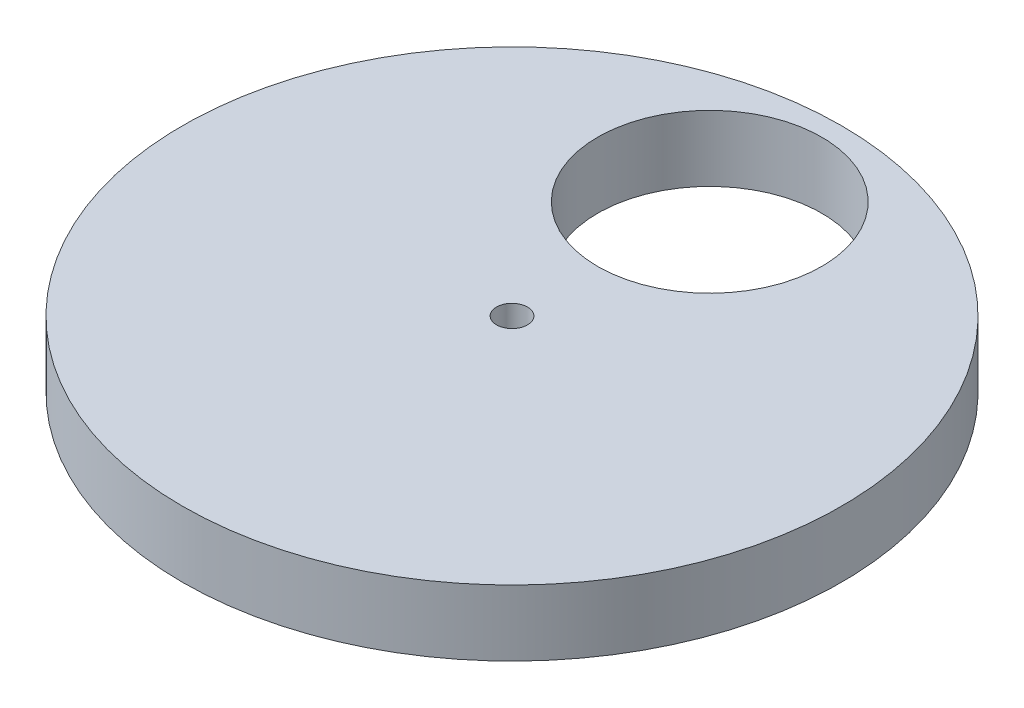
ISO-10303-21;
HEADER;
FILE_DESCRIPTION(('STEP AP214'),'2;1');
FILE_NAME('part.step','',(''),(''),'','','');
FILE_SCHEMA(('AUTOMOTIVE_DESIGN { 1 0 10303 214 1 1 1 1 }'));
ENDSEC;
DATA;
#1=APPLICATION_CONTEXT('core data for automotive mechanical design processes');
#2=APPLICATION_PROTOCOL_DEFINITION('international standard','automotive_design',2000,#1);
#3=PRODUCT_CONTEXT('',#1,'mechanical');
#4=PRODUCT('Part','Part','',(#3));
#5=PRODUCT_RELATED_PRODUCT_CATEGORY('part','',(#4));
#6=PRODUCT_DEFINITION_FORMATION('','',#4);
#7=PRODUCT_DEFINITION_CONTEXT('part definition',#1,'design');
#8=PRODUCT_DEFINITION('design','',#6,#7);
#9=PRODUCT_DEFINITION_SHAPE('','',#8);
#10=(LENGTH_UNIT() NAMED_UNIT(*) SI_UNIT(.MILLI.,.METRE.));
#11=(NAMED_UNIT(*) PLANE_ANGLE_UNIT() SI_UNIT($,.RADIAN.));
#12=(NAMED_UNIT(*) SI_UNIT($,.STERADIAN.) SOLID_ANGLE_UNIT());
#13=UNCERTAINTY_MEASURE_WITH_UNIT(LENGTH_MEASURE(1.E-05),#10,'distance_accuracy_value','');
#14=(GEOMETRIC_REPRESENTATION_CONTEXT(3) GLOBAL_UNCERTAINTY_ASSIGNED_CONTEXT((#13)) GLOBAL_UNIT_ASSIGNED_CONTEXT((#10,
#11,#12)) REPRESENTATION_CONTEXT('',''));
#15=CARTESIAN_POINT('',(0.,0.,0.));
#16=DIRECTION('',(0.,0.,1.));
#17=DIRECTION('',(1.,0.,0.));
#18=AXIS2_PLACEMENT_3D('',#15,#16,#17);
#19=CARTESIAN_POINT('',(0.,10.,0.));
#20=DIRECTION('',(0.,-1.,0.));
#21=DIRECTION('',(0.,0.,-1.));
#22=AXIS2_PLACEMENT_3D('',#19,#20,#21);
#23=CYLINDRICAL_SURFACE('',#22,50.);
#24=CARTESIAN_POINT('',(0.,10.,0.));
#25=DIRECTION('',(0.,1.,0.));
#26=DIRECTION('',(0.,0.,1.));
#27=AXIS2_PLACEMENT_3D('',#24,#25,#26);
#28=CIRCLE('',#27,50.);
#29=CARTESIAN_POINT('',(0.,10.,50.));
#30=VERTEX_POINT('',#29);
#31=EDGE_CURVE('E10',#30,#30,#28,.T.);
#32=ORIENTED_EDGE('',*,*,#31,.F.);
#33=EDGE_LOOP('',(#32));
#34=FACE_BOUND('',#33,.T.);
#35=CARTESIAN_POINT('',(0.,0.,0.));
#36=DIRECTION('',(0.,1.,0.));
#37=DIRECTION('',(0.,0.,1.));
#38=AXIS2_PLACEMENT_3D('',#35,#36,#37);
#39=CIRCLE('',#38,50.);
#40=CARTESIAN_POINT('',(0.,0.,50.));
#41=VERTEX_POINT('',#40);
#42=EDGE_CURVE('E47',#41,#41,#39,.T.);
#43=ORIENTED_EDGE('',*,*,#42,.T.);
#44=EDGE_LOOP('',(#43));
#45=FACE_BOUND('',#44,.T.);
#46=ADVANCED_FACE('F39',(#34,#45),#23,.T.);
#47=CARTESIAN_POINT('',(0.,10.,0.));
#48=DIRECTION('',(0.,1.,0.));
#49=DIRECTION('',(0.,0.,1.));
#50=AXIS2_PLACEMENT_3D('',#47,#48,#49);
#51=PLANE('',#50);
#52=CARTESIAN_POINT('',(0.,10.,0.));
#53=DIRECTION('',(0.,1.,0.));
#54=DIRECTION('',(0.,0.,1.));
#55=AXIS2_PLACEMENT_3D('',#52,#53,#54);
#56=CIRCLE('',#55,2.35);
#57=CARTESIAN_POINT('',(0.,10.,2.35));
#58=VERTEX_POINT('',#57);
#59=EDGE_CURVE('E59',#58,#58,#56,.T.);
#60=ORIENTED_EDGE('',*,*,#59,.F.);
#61=EDGE_LOOP('',(#60));
#62=FACE_BOUND('',#61,.T.);
#63=CARTESIAN_POINT('',(0.,10.,-30.));
#64=DIRECTION('',(0.,1.,0.));
#65=DIRECTION('',(0.,0.,1.));
#66=AXIS2_PLACEMENT_3D('',#63,#64,#65);
#67=CIRCLE('',#66,17.);
#68=CARTESIAN_POINT('',(0.,10.,-13.));
#69=VERTEX_POINT('',#68);
#70=EDGE_CURVE('E54',#69,#69,#67,.T.);
#71=ORIENTED_EDGE('',*,*,#70,.F.);
#72=EDGE_LOOP('',(#71));
#73=FACE_BOUND('',#72,.T.);
#74=ORIENTED_EDGE('',*,*,#31,.T.);
#75=EDGE_LOOP('',(#74));
#76=FACE_BOUND('',#75,.T.);
#77=ADVANCED_FACE('F76',(#62,#73,#76),#51,.T.);
#78=CARTESIAN_POINT('',(0.,0.,0.));
#79=DIRECTION('',(0.,1.,0.));
#80=DIRECTION('',(0.,0.,1.));
#81=AXIS2_PLACEMENT_3D('',#78,#79,#80);
#82=PLANE('',#81);
#83=CARTESIAN_POINT('',(0.,0.,-30.));
#84=DIRECTION('',(0.,1.,0.));
#85=DIRECTION('',(0.,0.,1.));
#86=AXIS2_PLACEMENT_3D('',#83,#84,#85);
#87=CIRCLE('',#86,17.);
#88=CARTESIAN_POINT('',(0.,0.,-13.));
#89=VERTEX_POINT('',#88);
#90=EDGE_CURVE('E42',#89,#89,#87,.T.);
#91=ORIENTED_EDGE('',*,*,#90,.T.);
#92=EDGE_LOOP('',(#91));
#93=FACE_BOUND('',#92,.T.);
#94=ORIENTED_EDGE('',*,*,#42,.F.);
#95=EDGE_LOOP('',(#94));
#96=FACE_BOUND('',#95,.T.);
#97=ADVANCED_FACE('F79',(#93,#96),#82,.F.);
#98=CARTESIAN_POINT('',(0.,-108.,-30.));
#99=DIRECTION('',(0.,1.,0.));
#100=DIRECTION('',(0.,0.,1.));
#101=AXIS2_PLACEMENT_3D('',#98,#99,#100);
#102=CYLINDRICAL_SURFACE('',#101,17.);
#103=ORIENTED_EDGE('',*,*,#70,.T.);
#104=EDGE_LOOP('',(#103));
#105=FACE_BOUND('',#104,.T.);
#106=ORIENTED_EDGE('',*,*,#90,.F.);
#107=EDGE_LOOP('',(#106));
#108=FACE_BOUND('',#107,.T.);
#109=ADVANCED_FACE('F72',(#105,#108),#102,.F.);
#110=CARTESIAN_POINT('',(0.,4.,0.));
#111=DIRECTION('',(0.,1.,0.));
#112=DIRECTION('',(0.,0.,1.));
#113=AXIS2_PLACEMENT_3D('',#110,#111,#112);
#114=CYLINDRICAL_SURFACE('',#113,2.35);
#115=CARTESIAN_POINT('',(0.,4.,0.));
#116=DIRECTION('',(0.,1.,0.));
#117=DIRECTION('',(0.,0.,1.));
#118=AXIS2_PLACEMENT_3D('',#115,#116,#117);
#119=CIRCLE('',#118,2.35);
#120=CARTESIAN_POINT('',(0.,4.,2.35));
#121=VERTEX_POINT('',#120);
#122=EDGE_CURVE('E58',#121,#121,#119,.T.);
#123=ORIENTED_EDGE('',*,*,#122,.F.);
#124=EDGE_LOOP('',(#123));
#125=FACE_BOUND('',#124,.T.);
#126=ORIENTED_EDGE('',*,*,#59,.T.);
#127=EDGE_LOOP('',(#126));
#128=FACE_BOUND('',#127,.T.);
#129=ADVANCED_FACE('F69',(#125,#128),#114,.F.);
#130=CARTESIAN_POINT('',(0.,4.,0.));
#131=DIRECTION('',(0.,1.,0.));
#132=DIRECTION('',(0.,0.,1.));
#133=AXIS2_PLACEMENT_3D('',#130,#131,#132);
#134=PLANE('',#133);
#135=ORIENTED_EDGE('',*,*,#122,.T.);
#136=EDGE_LOOP('',(#135));
#137=FACE_BOUND('',#136,.T.);
#138=ADVANCED_FACE('F67',(#137),#134,.T.);
#139=CLOSED_SHELL('',(#46,#77,#97,#109,#129,#138));
#140=MANIFOLD_SOLID_BREP('B2',#139);
#141=ADVANCED_BREP_SHAPE_REPRESENTATION('',(#18,#140),#14);
#142=SHAPE_DEFINITION_REPRESENTATION(#9,#141);
ENDSEC;
END-ISO-10303-21;
